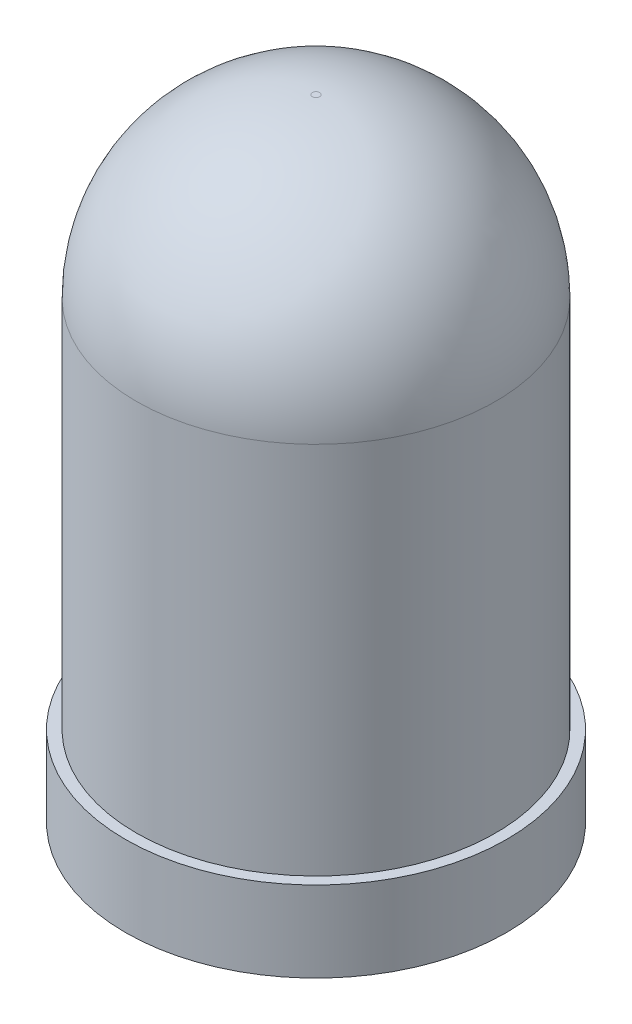
ISO-10303-21;
HEADER;
FILE_DESCRIPTION(('STEP AP214'),'2;1');
FILE_NAME('part.step','',(''),(''),'','','');
FILE_SCHEMA(('AUTOMOTIVE_DESIGN { 1 0 10303 214 1 1 1 1 }'));
ENDSEC;
DATA;
#1=APPLICATION_CONTEXT('core data for automotive mechanical design processes');
#2=APPLICATION_PROTOCOL_DEFINITION('international standard','automotive_design',2000,#1);
#3=PRODUCT_CONTEXT('',#1,'mechanical');
#4=PRODUCT('Part','Part','',(#3));
#5=PRODUCT_RELATED_PRODUCT_CATEGORY('part','',(#4));
#6=PRODUCT_DEFINITION_FORMATION('','',#4);
#7=PRODUCT_DEFINITION_CONTEXT('part definition',#1,'design');
#8=PRODUCT_DEFINITION('design','',#6,#7);
#9=PRODUCT_DEFINITION_SHAPE('','',#8);
#10=(LENGTH_UNIT() NAMED_UNIT(*) SI_UNIT(.MILLI.,.METRE.));
#11=(NAMED_UNIT(*) PLANE_ANGLE_UNIT() SI_UNIT($,.RADIAN.));
#12=(NAMED_UNIT(*) SI_UNIT($,.STERADIAN.) SOLID_ANGLE_UNIT());
#13=UNCERTAINTY_MEASURE_WITH_UNIT(LENGTH_MEASURE(1.E-05),#10,'distance_accuracy_value','');
#14=(GEOMETRIC_REPRESENTATION_CONTEXT(3) GLOBAL_UNCERTAINTY_ASSIGNED_CONTEXT((#13)) GLOBAL_UNIT_ASSIGNED_CONTEXT((#10,
#11,#12)) REPRESENTATION_CONTEXT('',''));
#15=CARTESIAN_POINT('',(0.,0.,0.));
#16=DIRECTION('',(0.,0.,1.));
#17=DIRECTION('',(1.,0.,0.));
#18=AXIS2_PLACEMENT_3D('',#15,#16,#17);
#19=CARTESIAN_POINT('',(0.,0.,0.));
#20=DIRECTION('',(0.,-1.,0.));
#21=DIRECTION('',(0.,0.,-1.));
#22=AXIS2_PLACEMENT_3D('',#19,#20,#21);
#23=PLANE('',#22);
#24=CARTESIAN_POINT('',(0.,0.,0.));
#25=DIRECTION('',(0.,-1.,0.));
#26=DIRECTION('',(0.,0.,-1.));
#27=AXIS2_PLACEMENT_3D('',#24,#25,#26);
#28=CIRCLE('',#27,2.6);
#29=CARTESIAN_POINT('',(0.,0.,-2.6));
#30=VERTEX_POINT('',#29);
#31=EDGE_CURVE('E10',#30,#30,#28,.T.);
#32=ORIENTED_EDGE('',*,*,#31,.T.);
#33=EDGE_LOOP('',(#32));
#34=FACE_BOUND('',#33,.T.);
#35=ADVANCED_FACE('F43',(#34),#23,.T.);
#36=CARTESIAN_POINT('',(0.,0.,0.));
#37=DIRECTION('',(0.,-1.,0.));
#38=DIRECTION('',(0.,0.,-1.));
#39=AXIS2_PLACEMENT_3D('',#36,#37,#38);
#40=CYLINDRICAL_SURFACE('',#39,2.6);
#41=CARTESIAN_POINT('',(0.,1.1,0.));
#42=DIRECTION('',(0.,-1.,0.));
#43=DIRECTION('',(0.,0.,-1.));
#44=AXIS2_PLACEMENT_3D('',#41,#42,#43);
#45=CIRCLE('',#44,2.6);
#46=CARTESIAN_POINT('',(0.,1.1,-2.6));
#47=VERTEX_POINT('',#46);
#48=EDGE_CURVE('E49',#47,#47,#45,.T.);
#49=ORIENTED_EDGE('',*,*,#48,.T.);
#50=EDGE_LOOP('',(#49));
#51=FACE_BOUND('',#50,.T.);
#52=ORIENTED_EDGE('',*,*,#31,.F.);
#53=EDGE_LOOP('',(#52));
#54=FACE_BOUND('',#53,.T.);
#55=ADVANCED_FACE('F78',(#51,#54),#40,.T.);
#56=CARTESIAN_POINT('',(2.6,1.1,0.));
#57=DIRECTION('',(0.,1.,0.));
#58=DIRECTION('',(0.,0.,1.));
#59=AXIS2_PLACEMENT_3D('',#56,#57,#58);
#60=PLANE('',#59);
#61=CARTESIAN_POINT('',(0.,1.1,0.));
#62=DIRECTION('',(0.,-1.,0.));
#63=DIRECTION('',(0.,0.,-1.));
#64=AXIS2_PLACEMENT_3D('',#61,#62,#63);
#65=CIRCLE('',#64,2.45);
#66=CARTESIAN_POINT('',(0.,1.1,-2.45));
#67=VERTEX_POINT('',#66);
#68=EDGE_CURVE('E53',#67,#67,#65,.T.);
#69=ORIENTED_EDGE('',*,*,#68,.T.);
#70=EDGE_LOOP('',(#69));
#71=FACE_BOUND('',#70,.T.);
#72=ORIENTED_EDGE('',*,*,#48,.F.);
#73=EDGE_LOOP('',(#72));
#74=FACE_BOUND('',#73,.T.);
#75=ADVANCED_FACE('F82',(#71,#74),#60,.T.);
#76=CARTESIAN_POINT('',(0.,0.,0.));
#77=DIRECTION('',(0.,-1.,0.));
#78=DIRECTION('',(0.,0.,-1.));
#79=AXIS2_PLACEMENT_3D('',#76,#77,#78);
#80=CYLINDRICAL_SURFACE('',#79,2.45);
#81=CARTESIAN_POINT('',(0.,6.19999999999998,0.));
#82=DIRECTION('',(0.,-1.,0.));
#83=DIRECTION('',(0.,0.,-1.));
#84=AXIS2_PLACEMENT_3D('',#81,#82,#83);
#85=CIRCLE('',#84,2.45);
#86=CARTESIAN_POINT('',(0.,6.19999999999998,-2.45));
#87=VERTEX_POINT('',#86);
#88=EDGE_CURVE('E57',#87,#87,#85,.T.);
#89=ORIENTED_EDGE('',*,*,#88,.T.);
#90=EDGE_LOOP('',(#89));
#91=FACE_BOUND('',#90,.T.);
#92=ORIENTED_EDGE('',*,*,#68,.F.);
#93=EDGE_LOOP('',(#92));
#94=FACE_BOUND('',#93,.T.);
#95=ADVANCED_FACE('F75',(#91,#94),#80,.T.);
#96=CARTESIAN_POINT('',(0.,6.2,0.));
#97=DIRECTION('',(0.,-1.,0.));
#98=DIRECTION('',(0.,0.,-1.));
#99=AXIS2_PLACEMENT_3D('',#96,#97,#98);
#100=DEGENERATE_TOROIDAL_SURFACE('',#99,0.050000000000001,2.4,.T.);
#101=CARTESIAN_POINT('',(0.,8.6,0.));
#102=DIRECTION('',(0.,-1.,0.));
#103=DIRECTION('',(0.,0.,-1.));
#104=AXIS2_PLACEMENT_3D('',#101,#102,#103);
#105=CIRCLE('',#104,0.0499999999999841);
#106=CARTESIAN_POINT('',(0.,8.6,-0.0499999999999841));
#107=VERTEX_POINT('',#106);
#108=EDGE_CURVE('E62',#107,#107,#105,.T.);
#109=ORIENTED_EDGE('',*,*,#108,.T.);
#110=EDGE_LOOP('',(#109));
#111=FACE_BOUND('',#110,.T.);
#112=ORIENTED_EDGE('',*,*,#88,.F.);
#113=EDGE_LOOP('',(#112));
#114=FACE_BOUND('',#113,.T.);
#115=ADVANCED_FACE('F66',(#111,#114),#100,.T.);
#116=CARTESIAN_POINT('',(0.0499999999999837,8.6,0.));
#117=DIRECTION('',(0.,1.,0.));
#118=DIRECTION('',(0.,0.,1.));
#119=AXIS2_PLACEMENT_3D('',#116,#117,#118);
#120=PLANE('',#119);
#121=ORIENTED_EDGE('',*,*,#108,.F.);
#122=EDGE_LOOP('',(#121));
#123=FACE_BOUND('',#122,.T.);
#124=ADVANCED_FACE('F69',(#123),#120,.T.);
#125=CLOSED_SHELL('',(#35,#55,#75,#95,#115,#124));
#126=MANIFOLD_SOLID_BREP('B2',#125);
#127=ADVANCED_BREP_SHAPE_REPRESENTATION('',(#18,#126),#14);
#128=SHAPE_DEFINITION_REPRESENTATION(#9,#127);
ENDSEC;
END-ISO-10303-21;
